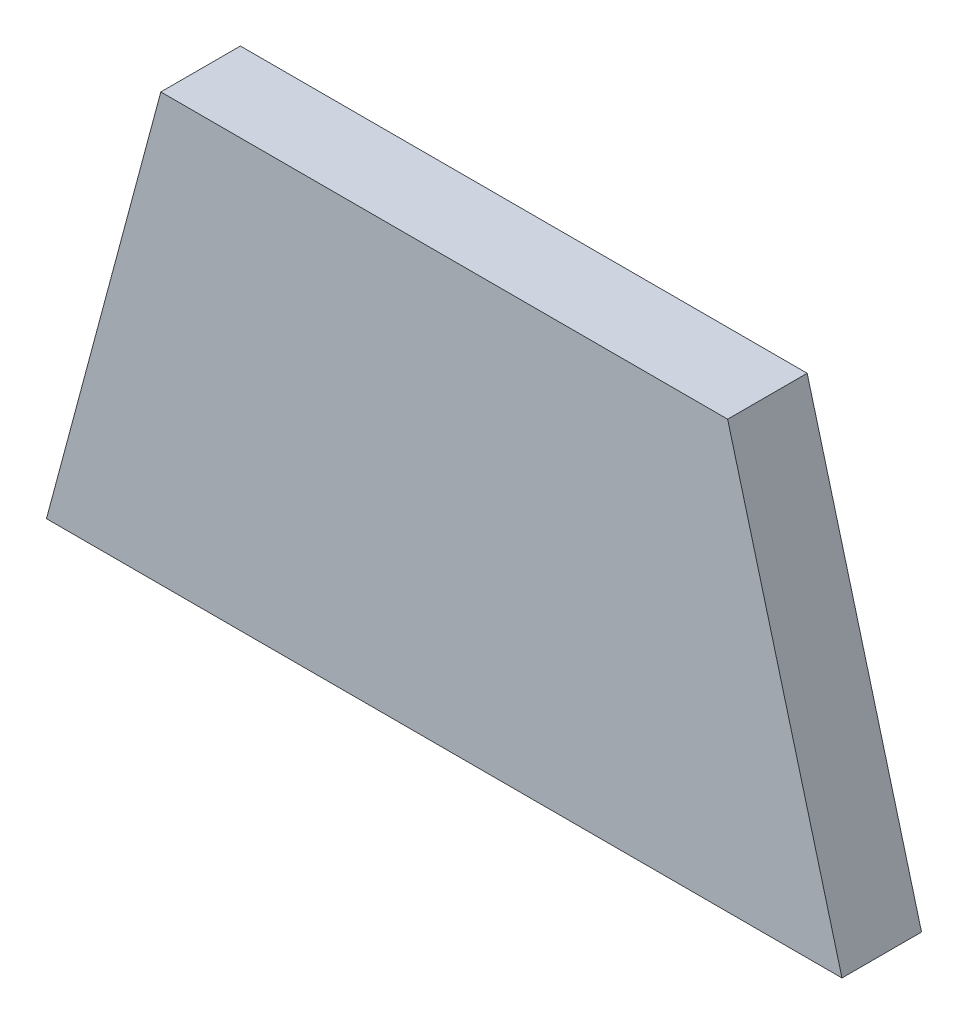
ISO-10303-21;
HEADER;
FILE_DESCRIPTION(('STEP AP214'),'2;1');
FILE_NAME('part.step','',(''),(''),'','','');
FILE_SCHEMA(('AUTOMOTIVE_DESIGN { 1 0 10303 214 1 1 1 1 }'));
ENDSEC;
DATA;
#1=APPLICATION_CONTEXT('core data for automotive mechanical design processes');
#2=APPLICATION_PROTOCOL_DEFINITION('international standard','automotive_design',2000,#1);
#3=PRODUCT_CONTEXT('',#1,'mechanical');
#4=PRODUCT('Part','Part','',(#3));
#5=PRODUCT_RELATED_PRODUCT_CATEGORY('part','',(#4));
#6=PRODUCT_DEFINITION_FORMATION('','',#4);
#7=PRODUCT_DEFINITION_CONTEXT('part definition',#1,'design');
#8=PRODUCT_DEFINITION('design','',#6,#7);
#9=PRODUCT_DEFINITION_SHAPE('','',#8);
#10=(LENGTH_UNIT() NAMED_UNIT(*) SI_UNIT(.MILLI.,.METRE.));
#11=(NAMED_UNIT(*) PLANE_ANGLE_UNIT() SI_UNIT($,.RADIAN.));
#12=(NAMED_UNIT(*) SI_UNIT($,.STERADIAN.) SOLID_ANGLE_UNIT());
#13=UNCERTAINTY_MEASURE_WITH_UNIT(LENGTH_MEASURE(1.E-05),#10,'distance_accuracy_value','');
#14=(GEOMETRIC_REPRESENTATION_CONTEXT(3) GLOBAL_UNCERTAINTY_ASSIGNED_CONTEXT((#13)) GLOBAL_UNIT_ASSIGNED_CONTEXT((#10,
#11,#12)) REPRESENTATION_CONTEXT('',''));
#15=CARTESIAN_POINT('',(0.,0.,0.));
#16=DIRECTION('',(0.,0.,1.));
#17=DIRECTION('',(1.,0.,0.));
#18=AXIS2_PLACEMENT_3D('',#15,#16,#17);
#19=CARTESIAN_POINT('',(-90.4875,136.266505111357,25.4));
#20=DIRECTION('',(0.965925826289067,-0.258819045102525,0.));
#21=DIRECTION('',(0.258819045102525,0.965925826289067,0.));
#22=AXIS2_PLACEMENT_3D('',#19,#20,#21);
#23=PLANE('',#22);
#24=DIRECTION('',(-0.258819045102525,-0.965925826289067,0.));
#25=VECTOR('',#24,1.);
#26=CARTESIAN_POINT('',(-90.4875,136.266505111357,0.));
#27=LINE('',#26,#25);
#28=CARTESIAN_POINT('',(-90.4875,136.266505111357,0.));
#29=VERTEX_POINT('',#28);
#30=CARTESIAN_POINT('',(-127.,0.,0.));
#31=VERTEX_POINT('',#30);
#32=EDGE_CURVE('E75',#29,#31,#27,.T.);
#33=ORIENTED_EDGE('',*,*,#32,.T.);
#34=DIRECTION('',(0.,0.,-1.));
#35=VECTOR('',#34,1.);
#36=CARTESIAN_POINT('',(-127.,0.,25.4));
#37=LINE('',#36,#35);
#38=CARTESIAN_POINT('',(-127.,0.,25.4));
#39=VERTEX_POINT('',#38);
#40=EDGE_CURVE('E11',#39,#31,#37,.T.);
#41=ORIENTED_EDGE('',*,*,#40,.F.);
#42=DIRECTION('',(-0.258819045102525,-0.965925826289067,0.));
#43=VECTOR('',#42,1.);
#44=CARTESIAN_POINT('',(-90.4875,136.266505111357,25.4));
#45=LINE('',#44,#43);
#46=CARTESIAN_POINT('',(-90.4875,136.266505111357,25.4));
#47=VERTEX_POINT('',#46);
#48=EDGE_CURVE('E93',#47,#39,#45,.T.);
#49=ORIENTED_EDGE('',*,*,#48,.F.);
#50=DIRECTION('',(0.,0.,-1.));
#51=VECTOR('',#50,1.);
#52=CARTESIAN_POINT('',(-90.4875,136.266505111357,25.4));
#53=LINE('',#52,#51);
#54=EDGE_CURVE('E87',#47,#29,#53,.T.);
#55=ORIENTED_EDGE('',*,*,#54,.T.);
#56=EDGE_LOOP('',(#33,#41,#49,#55));
#57=FACE_BOUND('',#56,.T.);
#58=ADVANCED_FACE('F31',(#57),#23,.F.);
#59=CARTESIAN_POINT('',(-127.,0.,25.4));
#60=DIRECTION('',(0.,1.,0.));
#61=DIRECTION('',(0.,0.,1.));
#62=AXIS2_PLACEMENT_3D('',#59,#60,#61);
#63=PLANE('',#62);
#64=DIRECTION('',(1.,0.,0.));
#65=VECTOR('',#64,1.);
#66=CARTESIAN_POINT('',(-127.,0.,0.));
#67=LINE('',#66,#65);
#68=CARTESIAN_POINT('',(127.,0.,0.));
#69=VERTEX_POINT('',#68);
#70=EDGE_CURVE('E71',#31,#69,#67,.T.);
#71=ORIENTED_EDGE('',*,*,#70,.T.);
#72=DIRECTION('',(0.,0.,-1.));
#73=VECTOR('',#72,1.);
#74=CARTESIAN_POINT('',(127.,0.,25.4));
#75=LINE('',#74,#73);
#76=CARTESIAN_POINT('',(127.,0.,25.4));
#77=VERTEX_POINT('',#76);
#78=EDGE_CURVE('E38',#77,#69,#75,.T.);
#79=ORIENTED_EDGE('',*,*,#78,.F.);
#80=DIRECTION('',(1.,0.,0.));
#81=VECTOR('',#80,1.);
#82=CARTESIAN_POINT('',(-127.,0.,25.4));
#83=LINE('',#82,#81);
#84=EDGE_CURVE('E83',#39,#77,#83,.T.);
#85=ORIENTED_EDGE('',*,*,#84,.F.);
#86=ORIENTED_EDGE('',*,*,#40,.T.);
#87=EDGE_LOOP('',(#71,#79,#85,#86));
#88=FACE_BOUND('',#87,.T.);
#89=ADVANCED_FACE('F82',(#88),#63,.F.);
#90=CARTESIAN_POINT('',(90.4875,136.266505111357,25.4));
#91=DIRECTION('',(-0.965925826289067,-0.258819045102525,0.));
#92=DIRECTION('',(0.258819045102525,-0.965925826289067,0.));
#93=AXIS2_PLACEMENT_3D('',#90,#91,#92);
#94=PLANE('',#93);
#95=DIRECTION('',(-0.258819045102525,0.965925826289067,0.));
#96=VECTOR('',#95,1.);
#97=CARTESIAN_POINT('',(90.4875,136.266505111357,0.));
#98=LINE('',#97,#96);
#99=CARTESIAN_POINT('',(90.4875,136.266505111357,0.));
#100=VERTEX_POINT('',#99);
#101=EDGE_CURVE('E76',#69,#100,#98,.T.);
#102=ORIENTED_EDGE('',*,*,#101,.T.);
#103=DIRECTION('',(0.,0.,-1.));
#104=VECTOR('',#103,1.);
#105=CARTESIAN_POINT('',(90.4875,136.266505111357,25.4));
#106=LINE('',#105,#104);
#107=CARTESIAN_POINT('',(90.4875,136.266505111357,25.4));
#108=VERTEX_POINT('',#107);
#109=EDGE_CURVE('E99',#108,#100,#106,.T.);
#110=ORIENTED_EDGE('',*,*,#109,.F.);
#111=DIRECTION('',(-0.258819045102525,0.965925826289067,0.));
#112=VECTOR('',#111,1.);
#113=CARTESIAN_POINT('',(90.4875,136.266505111357,25.4));
#114=LINE('',#113,#112);
#115=EDGE_CURVE('E50',#77,#108,#114,.T.);
#116=ORIENTED_EDGE('',*,*,#115,.F.);
#117=ORIENTED_EDGE('',*,*,#78,.T.);
#118=EDGE_LOOP('',(#102,#110,#116,#117));
#119=FACE_BOUND('',#118,.T.);
#120=ADVANCED_FACE('F102',(#119),#94,.F.);
#121=CARTESIAN_POINT('',(90.4875,136.266505111357,25.4));
#122=DIRECTION('',(0.,-1.,0.));
#123=DIRECTION('',(0.,0.,-1.));
#124=AXIS2_PLACEMENT_3D('',#121,#122,#123);
#125=PLANE('',#124);
#126=DIRECTION('',(-1.,0.,0.));
#127=VECTOR('',#126,1.);
#128=CARTESIAN_POINT('',(90.4875,136.266505111357,0.));
#129=LINE('',#128,#127);
#130=EDGE_CURVE('E91',#100,#29,#129,.T.);
#131=ORIENTED_EDGE('',*,*,#130,.T.);
#132=ORIENTED_EDGE('',*,*,#54,.F.);
#133=DIRECTION('',(-1.,0.,0.));
#134=VECTOR('',#133,1.);
#135=CARTESIAN_POINT('',(90.4875,136.266505111357,25.4));
#136=LINE('',#135,#134);
#137=EDGE_CURVE('E45',#108,#47,#136,.T.);
#138=ORIENTED_EDGE('',*,*,#137,.F.);
#139=ORIENTED_EDGE('',*,*,#109,.T.);
#140=EDGE_LOOP('',(#131,#132,#138,#139));
#141=FACE_BOUND('',#140,.T.);
#142=ADVANCED_FACE('F104',(#141),#125,.F.);
#143=CARTESIAN_POINT('',(-127.,0.,25.4));
#144=DIRECTION('',(0.,0.,1.));
#145=DIRECTION('',(1.,0.,0.));
#146=AXIS2_PLACEMENT_3D('',#143,#144,#145);
#147=PLANE('',#146);
#148=ORIENTED_EDGE('',*,*,#48,.T.);
#149=ORIENTED_EDGE('',*,*,#84,.T.);
#150=ORIENTED_EDGE('',*,*,#115,.T.);
#151=ORIENTED_EDGE('',*,*,#137,.T.);
#152=EDGE_LOOP('',(#148,#149,#150,#151));
#153=FACE_BOUND('',#152,.T.);
#154=ADVANCED_FACE('F105',(#153),#147,.T.);
#155=CARTESIAN_POINT('',(-127.,0.,0.));
#156=DIRECTION('',(0.,0.,1.));
#157=DIRECTION('',(1.,0.,0.));
#158=AXIS2_PLACEMENT_3D('',#155,#156,#157);
#159=PLANE('',#158);
#160=ORIENTED_EDGE('',*,*,#32,.F.);
#161=ORIENTED_EDGE('',*,*,#130,.F.);
#162=ORIENTED_EDGE('',*,*,#101,.F.);
#163=ORIENTED_EDGE('',*,*,#70,.F.);
#164=EDGE_LOOP('',(#160,#161,#162,#163));
#165=FACE_BOUND('',#164,.T.);
#166=ADVANCED_FACE('F72',(#165),#159,.F.);
#167=CLOSED_SHELL('',(#58,#89,#120,#142,#154,#166));
#168=MANIFOLD_SOLID_BREP('B2',#167);
#169=ADVANCED_BREP_SHAPE_REPRESENTATION('',(#18,#168),#14);
#170=SHAPE_DEFINITION_REPRESENTATION(#9,#169);
ENDSEC;
END-ISO-10303-21;
